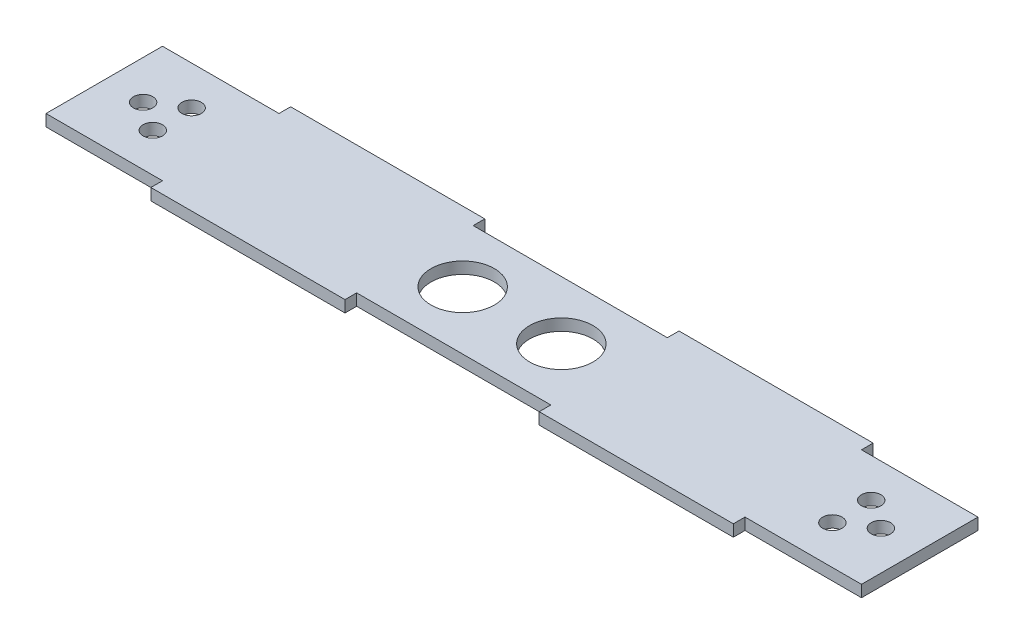
ISO-10303-21;
HEADER;
FILE_DESCRIPTION(('STEP AP214'),'2;1');
FILE_NAME('part.step','',(''),(''),'','','');
FILE_SCHEMA(('AUTOMOTIVE_DESIGN { 1 0 10303 214 1 1 1 1 }'));
ENDSEC;
DATA;
#1=APPLICATION_CONTEXT('core data for automotive mechanical design processes');
#2=APPLICATION_PROTOCOL_DEFINITION('international standard','automotive_design',2000,#1);
#3=PRODUCT_CONTEXT('',#1,'mechanical');
#4=PRODUCT('Part','Part','',(#3));
#5=PRODUCT_RELATED_PRODUCT_CATEGORY('part','',(#4));
#6=PRODUCT_DEFINITION_FORMATION('','',#4);
#7=PRODUCT_DEFINITION_CONTEXT('part definition',#1,'design');
#8=PRODUCT_DEFINITION('design','',#6,#7);
#9=PRODUCT_DEFINITION_SHAPE('','',#8);
#10=(LENGTH_UNIT() NAMED_UNIT(*) SI_UNIT(.MILLI.,.METRE.));
#11=(NAMED_UNIT(*) PLANE_ANGLE_UNIT() SI_UNIT($,.RADIAN.));
#12=(NAMED_UNIT(*) SI_UNIT($,.STERADIAN.) SOLID_ANGLE_UNIT());
#13=UNCERTAINTY_MEASURE_WITH_UNIT(LENGTH_MEASURE(1.E-05),#10,'distance_accuracy_value','');
#14=(GEOMETRIC_REPRESENTATION_CONTEXT(3) GLOBAL_UNCERTAINTY_ASSIGNED_CONTEXT((#13)) GLOBAL_UNIT_ASSIGNED_CONTEXT((#10,
#11,#12)) REPRESENTATION_CONTEXT('',''));
#15=CARTESIAN_POINT('',(0.,0.,0.));
#16=DIRECTION('',(0.,0.,1.));
#17=DIRECTION('',(1.,0.,0.));
#18=AXIS2_PLACEMENT_3D('',#15,#16,#17);
#19=CARTESIAN_POINT('',(-105.,3.,15.));
#20=DIRECTION('',(0.,0.,-1.));
#21=DIRECTION('',(-1.,0.,0.));
#22=AXIS2_PLACEMENT_3D('',#19,#20,#21);
#23=PLANE('',#22);
#24=DIRECTION('',(0.,-1.,0.));
#25=VECTOR('',#24,1.);
#26=CARTESIAN_POINT('',(25.,3.,15.));
#27=LINE('',#26,#25);
#28=CARTESIAN_POINT('',(25.,3.,15.));
#29=VERTEX_POINT('',#28);
#30=CARTESIAN_POINT('',(25.,0.,15.));
#31=VERTEX_POINT('',#30);
#32=EDGE_CURVE('E64',#29,#31,#27,.T.);
#33=ORIENTED_EDGE('',*,*,#32,.F.);
#34=DIRECTION('',(1.,0.,0.));
#35=VECTOR('',#34,1.);
#36=CARTESIAN_POINT('',(-105.,3.,15.));
#37=LINE('',#36,#35);
#38=CARTESIAN_POINT('',(-25.,3.,15.));
#39=VERTEX_POINT('',#38);
#40=EDGE_CURVE('E196',#39,#29,#37,.T.);
#41=ORIENTED_EDGE('',*,*,#40,.F.);
#42=DIRECTION('',(0.,-1.,0.));
#43=VECTOR('',#42,1.);
#44=CARTESIAN_POINT('',(-25.,3.,15.));
#45=LINE('',#44,#43);
#46=CARTESIAN_POINT('',(-25.,0.,15.));
#47=VERTEX_POINT('',#46);
#48=EDGE_CURVE('E227',#39,#47,#45,.T.);
#49=ORIENTED_EDGE('',*,*,#48,.T.);
#50=DIRECTION('',(1.,0.,0.));
#51=VECTOR('',#50,1.);
#52=CARTESIAN_POINT('',(-105.,0.,15.));
#53=LINE('',#52,#51);
#54=EDGE_CURVE('E311',#47,#31,#53,.T.);
#55=ORIENTED_EDGE('',*,*,#54,.T.);
#56=EDGE_LOOP('',(#33,#41,#49,#55));
#57=FACE_BOUND('',#56,.T.);
#58=ADVANCED_FACE('F39',(#57),#23,.F.);
#59=DIRECTION('',(0.,-1.,0.));
#60=VECTOR('',#59,1.);
#61=CARTESIAN_POINT('',(75.,3.,15.));
#62=LINE('',#61,#60);
#63=CARTESIAN_POINT('',(75.,3.,15.));
#64=VERTEX_POINT('',#63);
#65=CARTESIAN_POINT('',(75.,0.,15.));
#66=VERTEX_POINT('',#65);
#67=EDGE_CURVE('E208',#64,#66,#62,.T.);
#68=ORIENTED_EDGE('',*,*,#67,.T.);
#69=CARTESIAN_POINT('',(105.,0.,15.));
#70=VERTEX_POINT('',#69);
#71=EDGE_CURVE('E308',#66,#70,#53,.T.);
#72=ORIENTED_EDGE('',*,*,#71,.T.);
#73=DIRECTION('',(0.,-1.,0.));
#74=VECTOR('',#73,1.);
#75=CARTESIAN_POINT('',(105.,3.,15.));
#76=LINE('',#75,#74);
#77=CARTESIAN_POINT('',(105.,3.,15.));
#78=VERTEX_POINT('',#77);
#79=EDGE_CURVE('E299',#78,#70,#76,.T.);
#80=ORIENTED_EDGE('',*,*,#79,.F.);
#81=EDGE_CURVE('E56',#64,#78,#37,.T.);
#82=ORIENTED_EDGE('',*,*,#81,.F.);
#83=EDGE_LOOP('',(#68,#72,#80,#82));
#84=FACE_BOUND('',#83,.T.);
#85=ADVANCED_FACE('F361',(#84),#23,.F.);
#86=DIRECTION('',(0.,-1.,0.));
#87=VECTOR('',#86,1.);
#88=CARTESIAN_POINT('',(-75.,3.,15.));
#89=LINE('',#88,#87);
#90=CARTESIAN_POINT('',(-75.,3.,15.));
#91=VERTEX_POINT('',#90);
#92=CARTESIAN_POINT('',(-75.,0.,15.));
#93=VERTEX_POINT('',#92);
#94=EDGE_CURVE('E225',#91,#93,#89,.T.);
#95=ORIENTED_EDGE('',*,*,#94,.F.);
#96=CARTESIAN_POINT('',(-105.,3.,15.));
#97=VERTEX_POINT('',#96);
#98=EDGE_CURVE('E296',#97,#91,#37,.T.);
#99=ORIENTED_EDGE('',*,*,#98,.F.);
#100=DIRECTION('',(0.,-1.,0.));
#101=VECTOR('',#100,1.);
#102=CARTESIAN_POINT('',(-105.,3.,15.));
#103=LINE('',#102,#101);
#104=CARTESIAN_POINT('',(-105.,0.,15.));
#105=VERTEX_POINT('',#104);
#106=EDGE_CURVE('E314',#97,#105,#103,.T.);
#107=ORIENTED_EDGE('',*,*,#106,.T.);
#108=EDGE_CURVE('E289',#105,#93,#53,.T.);
#109=ORIENTED_EDGE('',*,*,#108,.T.);
#110=EDGE_LOOP('',(#95,#99,#107,#109));
#111=FACE_BOUND('',#110,.T.);
#112=ADVANCED_FACE('F385',(#111),#23,.F.);
#113=CARTESIAN_POINT('',(-105.,3.,-15.));
#114=DIRECTION('',(0.,0.,1.));
#115=DIRECTION('',(1.,0.,0.));
#116=AXIS2_PLACEMENT_3D('',#113,#114,#115);
#117=PLANE('',#116);
#118=DIRECTION('',(0.,-1.,0.));
#119=VECTOR('',#118,1.);
#120=CARTESIAN_POINT('',(25.,3.,-15.));
#121=LINE('',#120,#119);
#122=CARTESIAN_POINT('',(25.,3.,-15.));
#123=VERTEX_POINT('',#122);
#124=CARTESIAN_POINT('',(25.,0.,-15.));
#125=VERTEX_POINT('',#124);
#126=EDGE_CURVE('E255',#123,#125,#121,.T.);
#127=ORIENTED_EDGE('',*,*,#126,.T.);
#128=DIRECTION('',(-1.,0.,0.));
#129=VECTOR('',#128,1.);
#130=CARTESIAN_POINT('',(-105.,0.,-15.));
#131=LINE('',#130,#129);
#132=CARTESIAN_POINT('',(-25.,0.,-15.));
#133=VERTEX_POINT('',#132);
#134=EDGE_CURVE('E306',#125,#133,#131,.T.);
#135=ORIENTED_EDGE('',*,*,#134,.T.);
#136=DIRECTION('',(0.,-1.,0.));
#137=VECTOR('',#136,1.);
#138=CARTESIAN_POINT('',(-25.,3.,-15.));
#139=LINE('',#138,#137);
#140=CARTESIAN_POINT('',(-25.,3.,-15.));
#141=VERTEX_POINT('',#140);
#142=EDGE_CURVE('E282',#141,#133,#139,.T.);
#143=ORIENTED_EDGE('',*,*,#142,.F.);
#144=DIRECTION('',(-1.,0.,0.));
#145=VECTOR('',#144,1.);
#146=CARTESIAN_POINT('',(-105.,3.,-15.));
#147=LINE('',#146,#145);
#148=EDGE_CURVE('E294',#123,#141,#147,.T.);
#149=ORIENTED_EDGE('',*,*,#148,.F.);
#150=EDGE_LOOP('',(#127,#135,#143,#149));
#151=FACE_BOUND('',#150,.T.);
#152=ADVANCED_FACE('F399',(#151),#117,.F.);
#153=DIRECTION('',(0.,-1.,0.));
#154=VECTOR('',#153,1.);
#155=CARTESIAN_POINT('',(75.,3.,-15.));
#156=LINE('',#155,#154);
#157=CARTESIAN_POINT('',(75.,3.,-15.));
#158=VERTEX_POINT('',#157);
#159=CARTESIAN_POINT('',(75.,0.,-15.));
#160=VERTEX_POINT('',#159);
#161=EDGE_CURVE('E252',#158,#160,#156,.T.);
#162=ORIENTED_EDGE('',*,*,#161,.F.);
#163=CARTESIAN_POINT('',(105.,3.,-15.));
#164=VERTEX_POINT('',#163);
#165=EDGE_CURVE('E290',#164,#158,#147,.T.);
#166=ORIENTED_EDGE('',*,*,#165,.F.);
#167=DIRECTION('',(0.,-1.,0.));
#168=VECTOR('',#167,1.);
#169=CARTESIAN_POINT('',(105.,3.,-15.));
#170=LINE('',#169,#168);
#171=CARTESIAN_POINT('',(105.,0.,-15.));
#172=VERTEX_POINT('',#171);
#173=EDGE_CURVE('E11',#164,#172,#170,.T.);
#174=ORIENTED_EDGE('',*,*,#173,.T.);
#175=EDGE_CURVE('E303',#172,#160,#131,.T.);
#176=ORIENTED_EDGE('',*,*,#175,.T.);
#177=EDGE_LOOP('',(#162,#166,#174,#176));
#178=FACE_BOUND('',#177,.T.);
#179=ADVANCED_FACE('F412',(#178),#117,.F.);
#180=CARTESIAN_POINT('',(105.,3.,15.));
#181=DIRECTION('',(-1.,0.,0.));
#182=DIRECTION('',(0.,0.,1.));
#183=AXIS2_PLACEMENT_3D('',#180,#181,#182);
#184=PLANE('',#183);
#185=DIRECTION('',(0.,0.,-1.));
#186=VECTOR('',#185,1.);
#187=CARTESIAN_POINT('',(105.,0.,15.));
#188=LINE('',#187,#186);
#189=EDGE_CURVE('E285',#70,#172,#188,.T.);
#190=ORIENTED_EDGE('',*,*,#189,.T.);
#191=ORIENTED_EDGE('',*,*,#173,.F.);
#192=DIRECTION('',(0.,0.,-1.));
#193=VECTOR('',#192,1.);
#194=CARTESIAN_POINT('',(105.,3.,15.));
#195=LINE('',#194,#193);
#196=EDGE_CURVE('E286',#78,#164,#195,.T.);
#197=ORIENTED_EDGE('',*,*,#196,.F.);
#198=ORIENTED_EDGE('',*,*,#79,.T.);
#199=EDGE_LOOP('',(#190,#191,#197,#198));
#200=FACE_BOUND('',#199,.T.);
#201=ADVANCED_FACE('F41',(#200),#184,.F.);
#202=CARTESIAN_POINT('',(-75.,3.,-15.));
#203=VERTEX_POINT('',#202);
#204=CARTESIAN_POINT('',(-105.,3.,-15.));
#205=VERTEX_POINT('',#204);
#206=EDGE_CURVE('E288',#203,#205,#147,.T.);
#207=ORIENTED_EDGE('',*,*,#206,.F.);
#208=DIRECTION('',(0.,-1.,0.));
#209=VECTOR('',#208,1.);
#210=CARTESIAN_POINT('',(-75.,3.,-15.));
#211=LINE('',#210,#209);
#212=CARTESIAN_POINT('',(-75.,0.,-15.));
#213=VERTEX_POINT('',#212);
#214=EDGE_CURVE('E269',#203,#213,#211,.T.);
#215=ORIENTED_EDGE('',*,*,#214,.T.);
#216=CARTESIAN_POINT('',(-105.,0.,-15.));
#217=VERTEX_POINT('',#216);
#218=EDGE_CURVE('E302',#213,#217,#131,.T.);
#219=ORIENTED_EDGE('',*,*,#218,.T.);
#220=DIRECTION('',(0.,-1.,0.));
#221=VECTOR('',#220,1.);
#222=CARTESIAN_POINT('',(-105.,3.,-15.));
#223=LINE('',#222,#221);
#224=EDGE_CURVE('E48',#205,#217,#223,.T.);
#225=ORIENTED_EDGE('',*,*,#224,.F.);
#226=EDGE_LOOP('',(#207,#215,#219,#225));
#227=FACE_BOUND('',#226,.T.);
#228=ADVANCED_FACE('F410',(#227),#117,.F.);
#229=CARTESIAN_POINT('',(-105.,3.,15.));
#230=DIRECTION('',(1.,0.,0.));
#231=DIRECTION('',(0.,0.,-1.));
#232=AXIS2_PLACEMENT_3D('',#229,#230,#231);
#233=PLANE('',#232);
#234=DIRECTION('',(0.,0.,1.));
#235=VECTOR('',#234,1.);
#236=CARTESIAN_POINT('',(-105.,0.,15.));
#237=LINE('',#236,#235);
#238=EDGE_CURVE('E305',#217,#105,#237,.T.);
#239=ORIENTED_EDGE('',*,*,#238,.T.);
#240=ORIENTED_EDGE('',*,*,#106,.F.);
#241=DIRECTION('',(0.,0.,1.));
#242=VECTOR('',#241,1.);
#243=CARTESIAN_POINT('',(-105.,3.,15.));
#244=LINE('',#243,#242);
#245=EDGE_CURVE('E293',#205,#97,#244,.T.);
#246=ORIENTED_EDGE('',*,*,#245,.F.);
#247=ORIENTED_EDGE('',*,*,#224,.T.);
#248=EDGE_LOOP('',(#239,#240,#246,#247));
#249=FACE_BOUND('',#248,.T.);
#250=ADVANCED_FACE('F390',(#249),#233,.F.);
#251=CARTESIAN_POINT('',(0.,3.,0.));
#252=DIRECTION('',(0.,-1.,0.));
#253=DIRECTION('',(0.,0.,-1.));
#254=AXIS2_PLACEMENT_3D('',#251,#252,#253);
#255=PLANE('',#254);
#256=CARTESIAN_POINT('',(-95.,3.,0.));
#257=DIRECTION('',(0.,1.,0.));
#258=DIRECTION('',(0.,0.,1.));
#259=AXIS2_PLACEMENT_3D('',#256,#257,#258);
#260=CIRCLE('',#259,2.50000000000001);
#261=CARTESIAN_POINT('',(-95.,3.,2.50000000000001));
#262=VERTEX_POINT('',#261);
#263=EDGE_CURVE('E330',#262,#262,#260,.T.);
#264=ORIENTED_EDGE('',*,*,#263,.F.);
#265=EDGE_LOOP('',(#264));
#266=FACE_BOUND('',#265,.T.);
#267=CARTESIAN_POINT('',(-87.5000000000001,3.,-5.));
#268=DIRECTION('',(0.,1.,0.));
#269=DIRECTION('',(0.,0.,1.));
#270=AXIS2_PLACEMENT_3D('',#267,#268,#269);
#271=CIRCLE('',#270,2.5);
#272=CARTESIAN_POINT('',(-87.5000000000001,3.,-2.5));
#273=VERTEX_POINT('',#272);
#274=EDGE_CURVE('E713',#273,#273,#271,.T.);
#275=ORIENTED_EDGE('',*,*,#274,.F.);
#276=EDGE_LOOP('',(#275));
#277=FACE_BOUND('',#276,.T.);
#278=CARTESIAN_POINT('',(-87.5000000000001,3.,5.));
#279=DIRECTION('',(0.,1.,0.));
#280=DIRECTION('',(0.,0.,1.));
#281=AXIS2_PLACEMENT_3D('',#278,#279,#280);
#282=CIRCLE('',#281,2.5);
#283=CARTESIAN_POINT('',(-87.5000000000001,3.,7.5));
#284=VERTEX_POINT('',#283);
#285=EDGE_CURVE('E716',#284,#284,#282,.T.);
#286=ORIENTED_EDGE('',*,*,#285,.F.);
#287=EDGE_LOOP('',(#286));
#288=FACE_BOUND('',#287,.T.);
#289=CARTESIAN_POINT('',(87.5,3.,5.));
#290=DIRECTION('',(0.,1.,0.));
#291=DIRECTION('',(0.,0.,-1.));
#292=AXIS2_PLACEMENT_3D('',#289,#290,#291);
#293=CIRCLE('',#292,2.5);
#294=CARTESIAN_POINT('',(87.5,3.,2.5));
#295=VERTEX_POINT('',#294);
#296=EDGE_CURVE('E721',#295,#295,#293,.T.);
#297=ORIENTED_EDGE('',*,*,#296,.F.);
#298=EDGE_LOOP('',(#297));
#299=FACE_BOUND('',#298,.T.);
#300=CARTESIAN_POINT('',(87.5,3.,-5.));
#301=DIRECTION('',(0.,1.,0.));
#302=DIRECTION('',(0.,0.,-1.));
#303=AXIS2_PLACEMENT_3D('',#300,#301,#302);
#304=CIRCLE('',#303,2.5);
#305=CARTESIAN_POINT('',(87.5,3.,-7.49999999999999));
#306=VERTEX_POINT('',#305);
#307=EDGE_CURVE('E724',#306,#306,#304,.T.);
#308=ORIENTED_EDGE('',*,*,#307,.F.);
#309=EDGE_LOOP('',(#308));
#310=FACE_BOUND('',#309,.T.);
#311=CARTESIAN_POINT('',(95.,3.,0.));
#312=DIRECTION('',(0.,1.,0.));
#313=DIRECTION('',(0.,0.,-1.));
#314=AXIS2_PLACEMENT_3D('',#311,#312,#313);
#315=CIRCLE('',#314,2.50000000000001);
#316=CARTESIAN_POINT('',(95.,3.,-2.50000000000001));
#317=VERTEX_POINT('',#316);
#318=EDGE_CURVE('E726',#317,#317,#315,.T.);
#319=ORIENTED_EDGE('',*,*,#318,.F.);
#320=EDGE_LOOP('',(#319));
#321=FACE_BOUND('',#320,.T.);
#322=CARTESIAN_POINT('',(-12.7,3.,0.));
#323=DIRECTION('',(0.,1.,0.));
#324=DIRECTION('',(0.,0.,1.));
#325=AXIS2_PLACEMENT_3D('',#322,#323,#324);
#326=CIRCLE('',#325,8.15);
#327=CARTESIAN_POINT('',(-12.7,3.,8.15));
#328=VERTEX_POINT('',#327);
#329=EDGE_CURVE('E323',#328,#328,#326,.T.);
#330=ORIENTED_EDGE('',*,*,#329,.F.);
#331=EDGE_LOOP('',(#330));
#332=FACE_BOUND('',#331,.T.);
#333=CARTESIAN_POINT('',(12.7,3.,0.));
#334=DIRECTION('',(0.,1.,0.));
#335=DIRECTION('',(0.,0.,-1.));
#336=AXIS2_PLACEMENT_3D('',#333,#334,#335);
#337=CIRCLE('',#336,8.15);
#338=CARTESIAN_POINT('',(12.7,3.,-8.15000000000006));
#339=VERTEX_POINT('',#338);
#340=EDGE_CURVE('E343',#339,#339,#337,.T.);
#341=ORIENTED_EDGE('',*,*,#340,.F.);
#342=EDGE_LOOP('',(#341));
#343=FACE_BOUND('',#342,.T.);
#344=ORIENTED_EDGE('',*,*,#196,.T.);
#345=ORIENTED_EDGE('',*,*,#165,.T.);
#346=DIRECTION('',(0.,0.,-1.));
#347=VECTOR('',#346,1.);
#348=CARTESIAN_POINT('',(75.,3.,-18.));
#349=LINE('',#348,#347);
#350=CARTESIAN_POINT('',(75.,3.,-18.));
#351=VERTEX_POINT('',#350);
#352=EDGE_CURVE('E241',#158,#351,#349,.T.);
#353=ORIENTED_EDGE('',*,*,#352,.T.);
#354=DIRECTION('',(-1.,0.,0.));
#355=VECTOR('',#354,1.);
#356=CARTESIAN_POINT('',(25.,3.,-18.));
#357=LINE('',#356,#355);
#358=CARTESIAN_POINT('',(25.,3.,-18.));
#359=VERTEX_POINT('',#358);
#360=EDGE_CURVE('E234',#351,#359,#357,.T.);
#361=ORIENTED_EDGE('',*,*,#360,.T.);
#362=DIRECTION('',(0.,0.,1.));
#363=VECTOR('',#362,1.);
#364=CARTESIAN_POINT('',(25.,3.,-18.));
#365=LINE('',#364,#363);
#366=EDGE_CURVE('E237',#359,#123,#365,.T.);
#367=ORIENTED_EDGE('',*,*,#366,.T.);
#368=ORIENTED_EDGE('',*,*,#148,.T.);
#369=DIRECTION('',(0.,0.,-1.));
#370=VECTOR('',#369,1.);
#371=CARTESIAN_POINT('',(-25.,3.,-15.));
#372=LINE('',#371,#370);
#373=CARTESIAN_POINT('',(-25.,3.,-18.));
#374=VERTEX_POINT('',#373);
#375=EDGE_CURVE('E262',#141,#374,#372,.T.);
#376=ORIENTED_EDGE('',*,*,#375,.T.);
#377=DIRECTION('',(-1.,0.,0.));
#378=VECTOR('',#377,1.);
#379=CARTESIAN_POINT('',(-75.,3.,-18.));
#380=LINE('',#379,#378);
#381=CARTESIAN_POINT('',(-75.,3.,-18.));
#382=VERTEX_POINT('',#381);
#383=EDGE_CURVE('E264',#374,#382,#380,.T.);
#384=ORIENTED_EDGE('',*,*,#383,.T.);
#385=DIRECTION('',(0.,0.,1.));
#386=VECTOR('',#385,1.);
#387=CARTESIAN_POINT('',(-75.,3.,-15.));
#388=LINE('',#387,#386);
#389=EDGE_CURVE('E267',#382,#203,#388,.T.);
#390=ORIENTED_EDGE('',*,*,#389,.T.);
#391=ORIENTED_EDGE('',*,*,#206,.T.);
#392=ORIENTED_EDGE('',*,*,#245,.T.);
#393=ORIENTED_EDGE('',*,*,#98,.T.);
#394=DIRECTION('',(0.,0.,1.));
#395=VECTOR('',#394,1.);
#396=CARTESIAN_POINT('',(-75.,3.,15.));
#397=LINE('',#396,#395);
#398=CARTESIAN_POINT('',(-75.,3.,18.));
#399=VERTEX_POINT('',#398);
#400=EDGE_CURVE('E218',#91,#399,#397,.T.);
#401=ORIENTED_EDGE('',*,*,#400,.T.);
#402=DIRECTION('',(1.,0.,0.));
#403=VECTOR('',#402,1.);
#404=CARTESIAN_POINT('',(-75.,3.,18.));
#405=LINE('',#404,#403);
#406=CARTESIAN_POINT('',(-25.,3.,18.));
#407=VERTEX_POINT('',#406);
#408=EDGE_CURVE('E212',#399,#407,#405,.T.);
#409=ORIENTED_EDGE('',*,*,#408,.T.);
#410=DIRECTION('',(0.,0.,-1.));
#411=VECTOR('',#410,1.);
#412=CARTESIAN_POINT('',(-25.,3.,15.));
#413=LINE('',#412,#411);
#414=EDGE_CURVE('E215',#407,#39,#413,.T.);
#415=ORIENTED_EDGE('',*,*,#414,.T.);
#416=ORIENTED_EDGE('',*,*,#40,.T.);
#417=DIRECTION('',(0.,0.,1.));
#418=VECTOR('',#417,1.);
#419=CARTESIAN_POINT('',(25.,3.,18.));
#420=LINE('',#419,#418);
#421=CARTESIAN_POINT('',(25.,3.,18.));
#422=VERTEX_POINT('',#421);
#423=EDGE_CURVE('E191',#29,#422,#420,.T.);
#424=ORIENTED_EDGE('',*,*,#423,.T.);
#425=DIRECTION('',(1.,0.,0.));
#426=VECTOR('',#425,1.);
#427=CARTESIAN_POINT('',(25.,3.,18.));
#428=LINE('',#427,#426);
#429=CARTESIAN_POINT('',(75.,3.,18.));
#430=VERTEX_POINT('',#429);
#431=EDGE_CURVE('E180',#422,#430,#428,.T.);
#432=ORIENTED_EDGE('',*,*,#431,.T.);
#433=DIRECTION('',(0.,0.,-1.));
#434=VECTOR('',#433,1.);
#435=CARTESIAN_POINT('',(75.,3.,18.));
#436=LINE('',#435,#434);
#437=EDGE_CURVE('E190',#430,#64,#436,.T.);
#438=ORIENTED_EDGE('',*,*,#437,.T.);
#439=ORIENTED_EDGE('',*,*,#81,.T.);
#440=EDGE_LOOP('',(#344,#345,#353,#361,#367,#368,#376,#384,#390,#391,#392,#393,#401,#409,#415,
#416,#424,#432,#438,#439));
#441=FACE_BOUND('',#440,.T.);
#442=ADVANCED_FACE('F195',(#266,#277,#288,#299,#310,#321,#332,#343,#441),#255,.F.);
#443=CARTESIAN_POINT('',(0.,0.,0.));
#444=DIRECTION('',(0.,-1.,0.));
#445=DIRECTION('',(0.,0.,-1.));
#446=AXIS2_PLACEMENT_3D('',#443,#444,#445);
#447=PLANE('',#446);
#448=CARTESIAN_POINT('',(-95.,0.,0.));
#449=DIRECTION('',(0.,-1.,0.));
#450=DIRECTION('',(0.,0.,-1.));
#451=AXIS2_PLACEMENT_3D('',#448,#449,#450);
#452=CIRCLE('',#451,2.50000000000001);
#453=CARTESIAN_POINT('',(-95.,0.,-2.50000000000001));
#454=VERTEX_POINT('',#453);
#455=EDGE_CURVE('E43',#454,#454,#452,.T.);
#456=ORIENTED_EDGE('',*,*,#455,.F.);
#457=EDGE_LOOP('',(#456));
#458=FACE_BOUND('',#457,.T.);
#459=CARTESIAN_POINT('',(-87.5000000000001,0.,-5.));
#460=DIRECTION('',(0.,-1.,0.));
#461=DIRECTION('',(0.,0.,-1.));
#462=AXIS2_PLACEMENT_3D('',#459,#460,#461);
#463=CIRCLE('',#462,2.5);
#464=CARTESIAN_POINT('',(-87.5000000000001,0.,-7.49999999999999));
#465=VERTEX_POINT('',#464);
#466=EDGE_CURVE('E338',#465,#465,#463,.T.);
#467=ORIENTED_EDGE('',*,*,#466,.F.);
#468=EDGE_LOOP('',(#467));
#469=FACE_BOUND('',#468,.T.);
#470=CARTESIAN_POINT('',(-87.5000000000001,0.,5.));
#471=DIRECTION('',(0.,-1.,0.));
#472=DIRECTION('',(0.,0.,-1.));
#473=AXIS2_PLACEMENT_3D('',#470,#471,#472);
#474=CIRCLE('',#473,2.5);
#475=CARTESIAN_POINT('',(-87.5000000000001,0.,2.5));
#476=VERTEX_POINT('',#475);
#477=EDGE_CURVE('E336',#476,#476,#474,.T.);
#478=ORIENTED_EDGE('',*,*,#477,.F.);
#479=EDGE_LOOP('',(#478));
#480=FACE_BOUND('',#479,.T.);
#481=CARTESIAN_POINT('',(87.5,0.,5.));
#482=DIRECTION('',(0.,-1.,0.));
#483=DIRECTION('',(0.,0.,-1.));
#484=AXIS2_PLACEMENT_3D('',#481,#482,#483);
#485=CIRCLE('',#484,2.5);
#486=CARTESIAN_POINT('',(87.5,0.,2.5));
#487=VERTEX_POINT('',#486);
#488=EDGE_CURVE('E333',#487,#487,#485,.T.);
#489=ORIENTED_EDGE('',*,*,#488,.F.);
#490=EDGE_LOOP('',(#489));
#491=FACE_BOUND('',#490,.T.);
#492=CARTESIAN_POINT('',(87.5,0.,-5.));
#493=DIRECTION('',(0.,-1.,0.));
#494=DIRECTION('',(0.,0.,-1.));
#495=AXIS2_PLACEMENT_3D('',#492,#493,#494);
#496=CIRCLE('',#495,2.5);
#497=CARTESIAN_POINT('',(87.5,0.,-7.49999999999999));
#498=VERTEX_POINT('',#497);
#499=EDGE_CURVE('E329',#498,#498,#496,.T.);
#500=ORIENTED_EDGE('',*,*,#499,.F.);
#501=EDGE_LOOP('',(#500));
#502=FACE_BOUND('',#501,.T.);
#503=CARTESIAN_POINT('',(95.,0.,0.));
#504=DIRECTION('',(0.,-1.,0.));
#505=DIRECTION('',(0.,0.,-1.));
#506=AXIS2_PLACEMENT_3D('',#503,#504,#505);
#507=CIRCLE('',#506,2.50000000000001);
#508=CARTESIAN_POINT('',(95.,0.,-2.50000000000001));
#509=VERTEX_POINT('',#508);
#510=EDGE_CURVE('E326',#509,#509,#507,.T.);
#511=ORIENTED_EDGE('',*,*,#510,.F.);
#512=EDGE_LOOP('',(#511));
#513=FACE_BOUND('',#512,.T.);
#514=CARTESIAN_POINT('',(-12.7,0.,0.));
#515=DIRECTION('',(0.,-1.,0.));
#516=DIRECTION('',(0.,0.,-1.));
#517=AXIS2_PLACEMENT_3D('',#514,#515,#516);
#518=CIRCLE('',#517,8.15);
#519=CARTESIAN_POINT('',(-12.7,0.,-8.15));
#520=VERTEX_POINT('',#519);
#521=EDGE_CURVE('E322',#520,#520,#518,.T.);
#522=ORIENTED_EDGE('',*,*,#521,.F.);
#523=EDGE_LOOP('',(#522));
#524=FACE_BOUND('',#523,.T.);
#525=CARTESIAN_POINT('',(12.7,0.,0.));
#526=DIRECTION('',(0.,-1.,0.));
#527=DIRECTION('',(0.,0.,-1.));
#528=AXIS2_PLACEMENT_3D('',#525,#526,#527);
#529=CIRCLE('',#528,8.15);
#530=CARTESIAN_POINT('',(12.7,0.,-8.15000000000006));
#531=VERTEX_POINT('',#530);
#532=EDGE_CURVE('E319',#531,#531,#529,.T.);
#533=ORIENTED_EDGE('',*,*,#532,.F.);
#534=EDGE_LOOP('',(#533));
#535=FACE_BOUND('',#534,.T.);
#536=ORIENTED_EDGE('',*,*,#189,.F.);
#537=ORIENTED_EDGE('',*,*,#71,.F.);
#538=DIRECTION('',(0.,0.,-1.));
#539=VECTOR('',#538,1.);
#540=CARTESIAN_POINT('',(75.,0.,18.));
#541=LINE('',#540,#539);
#542=CARTESIAN_POINT('',(75.,0.,18.));
#543=VERTEX_POINT('',#542);
#544=EDGE_CURVE('E198',#543,#66,#541,.T.);
#545=ORIENTED_EDGE('',*,*,#544,.F.);
#546=DIRECTION('',(1.,0.,0.));
#547=VECTOR('',#546,1.);
#548=CARTESIAN_POINT('',(25.,0.,18.));
#549=LINE('',#548,#547);
#550=CARTESIAN_POINT('',(25.,0.,18.));
#551=VERTEX_POINT('',#550);
#552=EDGE_CURVE('E356',#551,#543,#549,.T.);
#553=ORIENTED_EDGE('',*,*,#552,.F.);
#554=DIRECTION('',(0.,0.,1.));
#555=VECTOR('',#554,1.);
#556=CARTESIAN_POINT('',(25.,0.,18.));
#557=LINE('',#556,#555);
#558=EDGE_CURVE('E202',#31,#551,#557,.T.);
#559=ORIENTED_EDGE('',*,*,#558,.F.);
#560=ORIENTED_EDGE('',*,*,#54,.F.);
#561=DIRECTION('',(0.,0.,-1.));
#562=VECTOR('',#561,1.);
#563=CARTESIAN_POINT('',(-25.,0.,15.));
#564=LINE('',#563,#562);
#565=CARTESIAN_POINT('',(-25.,0.,18.));
#566=VERTEX_POINT('',#565);
#567=EDGE_CURVE('E206',#566,#47,#564,.T.);
#568=ORIENTED_EDGE('',*,*,#567,.F.);
#569=DIRECTION('',(1.,0.,0.));
#570=VECTOR('',#569,1.);
#571=CARTESIAN_POINT('',(-75.,0.,18.));
#572=LINE('',#571,#570);
#573=CARTESIAN_POINT('',(-75.,0.,18.));
#574=VERTEX_POINT('',#573);
#575=EDGE_CURVE('E203',#574,#566,#572,.T.);
#576=ORIENTED_EDGE('',*,*,#575,.F.);
#577=DIRECTION('',(0.,0.,1.));
#578=VECTOR('',#577,1.);
#579=CARTESIAN_POINT('',(-75.,0.,15.));
#580=LINE('',#579,#578);
#581=EDGE_CURVE('E216',#93,#574,#580,.T.);
#582=ORIENTED_EDGE('',*,*,#581,.F.);
#583=ORIENTED_EDGE('',*,*,#108,.F.);
#584=ORIENTED_EDGE('',*,*,#238,.F.);
#585=ORIENTED_EDGE('',*,*,#218,.F.);
#586=DIRECTION('',(0.,0.,1.));
#587=VECTOR('',#586,1.);
#588=CARTESIAN_POINT('',(-75.,0.,-15.));
#589=LINE('',#588,#587);
#590=CARTESIAN_POINT('',(-75.,0.,-18.));
#591=VERTEX_POINT('',#590);
#592=EDGE_CURVE('E265',#591,#213,#589,.T.);
#593=ORIENTED_EDGE('',*,*,#592,.F.);
#594=DIRECTION('',(-1.,0.,0.));
#595=VECTOR('',#594,1.);
#596=CARTESIAN_POINT('',(-75.,0.,-18.));
#597=LINE('',#596,#595);
#598=CARTESIAN_POINT('',(-25.,0.,-18.));
#599=VERTEX_POINT('',#598);
#600=EDGE_CURVE('E271',#599,#591,#597,.T.);
#601=ORIENTED_EDGE('',*,*,#600,.F.);
#602=DIRECTION('',(0.,0.,-1.));
#603=VECTOR('',#602,1.);
#604=CARTESIAN_POINT('',(-25.,0.,-15.));
#605=LINE('',#604,#603);
#606=EDGE_CURVE('E261',#133,#599,#605,.T.);
#607=ORIENTED_EDGE('',*,*,#606,.F.);
#608=ORIENTED_EDGE('',*,*,#134,.F.);
#609=DIRECTION('',(0.,0.,1.));
#610=VECTOR('',#609,1.);
#611=CARTESIAN_POINT('',(25.,0.,-18.));
#612=LINE('',#611,#610);
#613=CARTESIAN_POINT('',(25.,0.,-18.));
#614=VERTEX_POINT('',#613);
#615=EDGE_CURVE('E246',#614,#125,#612,.T.);
#616=ORIENTED_EDGE('',*,*,#615,.F.);
#617=DIRECTION('',(-1.,0.,0.));
#618=VECTOR('',#617,1.);
#619=CARTESIAN_POINT('',(25.,0.,-18.));
#620=LINE('',#619,#618);
#621=CARTESIAN_POINT('',(75.,0.,-18.));
#622=VERTEX_POINT('',#621);
#623=EDGE_CURVE('E233',#622,#614,#620,.T.);
#624=ORIENTED_EDGE('',*,*,#623,.F.);
#625=DIRECTION('',(0.,0.,-1.));
#626=VECTOR('',#625,1.);
#627=CARTESIAN_POINT('',(75.,0.,-18.));
#628=LINE('',#627,#626);
#629=EDGE_CURVE('E238',#160,#622,#628,.T.);
#630=ORIENTED_EDGE('',*,*,#629,.F.);
#631=ORIENTED_EDGE('',*,*,#175,.F.);
#632=EDGE_LOOP('',(#536,#537,#545,#553,#559,#560,#568,#576,#582,#583,#584,#585,#593,#601,#607,
#608,#616,#624,#630,#631));
#633=FACE_BOUND('',#632,.T.);
#634=ADVANCED_FACE('F367',(#458,#469,#480,#491,#502,#513,#524,#535,#633),#447,.T.);
#635=CARTESIAN_POINT('',(-25.,3.,-15.));
#636=DIRECTION('',(-1.,0.,0.));
#637=DIRECTION('',(0.,0.,1.));
#638=AXIS2_PLACEMENT_3D('',#635,#636,#637);
#639=PLANE('',#638);
#640=ORIENTED_EDGE('',*,*,#606,.T.);
#641=DIRECTION('',(0.,-1.,0.));
#642=VECTOR('',#641,1.);
#643=CARTESIAN_POINT('',(-25.,3.,-18.));
#644=LINE('',#643,#642);
#645=EDGE_CURVE('E279',#374,#599,#644,.T.);
#646=ORIENTED_EDGE('',*,*,#645,.F.);
#647=ORIENTED_EDGE('',*,*,#375,.F.);
#648=ORIENTED_EDGE('',*,*,#142,.T.);
#649=EDGE_LOOP('',(#640,#646,#647,#648));
#650=FACE_BOUND('',#649,.T.);
#651=ADVANCED_FACE('F404',(#650),#639,.F.);
#652=CARTESIAN_POINT('',(-75.,3.,-18.));
#653=DIRECTION('',(0.,0.,1.));
#654=DIRECTION('',(1.,0.,0.));
#655=AXIS2_PLACEMENT_3D('',#652,#653,#654);
#656=PLANE('',#655);
#657=ORIENTED_EDGE('',*,*,#600,.T.);
#658=DIRECTION('',(0.,-1.,0.));
#659=VECTOR('',#658,1.);
#660=CARTESIAN_POINT('',(-75.,3.,-18.));
#661=LINE('',#660,#659);
#662=EDGE_CURVE('E276',#382,#591,#661,.T.);
#663=ORIENTED_EDGE('',*,*,#662,.F.);
#664=ORIENTED_EDGE('',*,*,#383,.F.);
#665=ORIENTED_EDGE('',*,*,#645,.T.);
#666=EDGE_LOOP('',(#657,#663,#664,#665));
#667=FACE_BOUND('',#666,.T.);
#668=ADVANCED_FACE('F608',(#667),#656,.F.);
#669=CARTESIAN_POINT('',(-75.,3.,-15.));
#670=DIRECTION('',(1.,0.,0.));
#671=DIRECTION('',(0.,0.,-1.));
#672=AXIS2_PLACEMENT_3D('',#669,#670,#671);
#673=PLANE('',#672);
#674=ORIENTED_EDGE('',*,*,#592,.T.);
#675=ORIENTED_EDGE('',*,*,#214,.F.);
#676=ORIENTED_EDGE('',*,*,#389,.F.);
#677=ORIENTED_EDGE('',*,*,#662,.T.);
#678=EDGE_LOOP('',(#674,#675,#676,#677));
#679=FACE_BOUND('',#678,.T.);
#680=ADVANCED_FACE('F604',(#679),#673,.F.);
#681=CARTESIAN_POINT('',(25.,3.,-18.));
#682=DIRECTION('',(0.,0.,1.));
#683=DIRECTION('',(1.,0.,0.));
#684=AXIS2_PLACEMENT_3D('',#681,#682,#683);
#685=PLANE('',#684);
#686=ORIENTED_EDGE('',*,*,#623,.T.);
#687=DIRECTION('',(0.,-1.,0.));
#688=VECTOR('',#687,1.);
#689=CARTESIAN_POINT('',(25.,3.,-18.));
#690=LINE('',#689,#688);
#691=EDGE_CURVE('E258',#359,#614,#690,.T.);
#692=ORIENTED_EDGE('',*,*,#691,.F.);
#693=ORIENTED_EDGE('',*,*,#360,.F.);
#694=DIRECTION('',(0.,-1.,0.));
#695=VECTOR('',#694,1.);
#696=CARTESIAN_POINT('',(75.,3.,-18.));
#697=LINE('',#696,#695);
#698=EDGE_CURVE('E243',#351,#622,#697,.T.);
#699=ORIENTED_EDGE('',*,*,#698,.T.);
#700=EDGE_LOOP('',(#686,#692,#693,#699));
#701=FACE_BOUND('',#700,.T.);
#702=ADVANCED_FACE('F600',(#701),#685,.F.);
#703=CARTESIAN_POINT('',(25.,3.,-18.));
#704=DIRECTION('',(1.,0.,0.));
#705=DIRECTION('',(0.,0.,-1.));
#706=AXIS2_PLACEMENT_3D('',#703,#704,#705);
#707=PLANE('',#706);
#708=ORIENTED_EDGE('',*,*,#615,.T.);
#709=ORIENTED_EDGE('',*,*,#126,.F.);
#710=ORIENTED_EDGE('',*,*,#366,.F.);
#711=ORIENTED_EDGE('',*,*,#691,.T.);
#712=EDGE_LOOP('',(#708,#709,#710,#711));
#713=FACE_BOUND('',#712,.T.);
#714=ADVANCED_FACE('F596',(#713),#707,.F.);
#715=CARTESIAN_POINT('',(75.,3.,-18.));
#716=DIRECTION('',(-1.,0.,0.));
#717=DIRECTION('',(0.,0.,1.));
#718=AXIS2_PLACEMENT_3D('',#715,#716,#717);
#719=PLANE('',#718);
#720=ORIENTED_EDGE('',*,*,#629,.T.);
#721=ORIENTED_EDGE('',*,*,#698,.F.);
#722=ORIENTED_EDGE('',*,*,#352,.F.);
#723=ORIENTED_EDGE('',*,*,#161,.T.);
#724=EDGE_LOOP('',(#720,#721,#722,#723));
#725=FACE_BOUND('',#724,.T.);
#726=ADVANCED_FACE('F593',(#725),#719,.F.);
#727=CARTESIAN_POINT('',(-75.,3.,18.));
#728=DIRECTION('',(0.,0.,-1.));
#729=DIRECTION('',(-1.,0.,0.));
#730=AXIS2_PLACEMENT_3D('',#727,#728,#729);
#731=PLANE('',#730);
#732=ORIENTED_EDGE('',*,*,#575,.T.);
#733=DIRECTION('',(0.,-1.,0.));
#734=VECTOR('',#733,1.);
#735=CARTESIAN_POINT('',(-25.,3.,18.));
#736=LINE('',#735,#734);
#737=EDGE_CURVE('E230',#407,#566,#736,.T.);
#738=ORIENTED_EDGE('',*,*,#737,.F.);
#739=ORIENTED_EDGE('',*,*,#408,.F.);
#740=DIRECTION('',(0.,-1.,0.));
#741=VECTOR('',#740,1.);
#742=CARTESIAN_POINT('',(-75.,3.,18.));
#743=LINE('',#742,#741);
#744=EDGE_CURVE('E219',#399,#574,#743,.T.);
#745=ORIENTED_EDGE('',*,*,#744,.T.);
#746=EDGE_LOOP('',(#732,#738,#739,#745));
#747=FACE_BOUND('',#746,.T.);
#748=ADVANCED_FACE('F377',(#747),#731,.F.);
#749=CARTESIAN_POINT('',(-25.,3.,15.));
#750=DIRECTION('',(-1.,0.,0.));
#751=DIRECTION('',(0.,0.,1.));
#752=AXIS2_PLACEMENT_3D('',#749,#750,#751);
#753=PLANE('',#752);
#754=ORIENTED_EDGE('',*,*,#567,.T.);
#755=ORIENTED_EDGE('',*,*,#48,.F.);
#756=ORIENTED_EDGE('',*,*,#414,.F.);
#757=ORIENTED_EDGE('',*,*,#737,.T.);
#758=EDGE_LOOP('',(#754,#755,#756,#757));
#759=FACE_BOUND('',#758,.T.);
#760=ADVANCED_FACE('F374',(#759),#753,.F.);
#761=CARTESIAN_POINT('',(-75.,3.,15.));
#762=DIRECTION('',(1.,0.,0.));
#763=DIRECTION('',(0.,0.,-1.));
#764=AXIS2_PLACEMENT_3D('',#761,#762,#763);
#765=PLANE('',#764);
#766=ORIENTED_EDGE('',*,*,#581,.T.);
#767=ORIENTED_EDGE('',*,*,#744,.F.);
#768=ORIENTED_EDGE('',*,*,#400,.F.);
#769=ORIENTED_EDGE('',*,*,#94,.T.);
#770=EDGE_LOOP('',(#766,#767,#768,#769));
#771=FACE_BOUND('',#770,.T.);
#772=ADVANCED_FACE('F380',(#771),#765,.F.);
#773=CARTESIAN_POINT('',(25.,3.,18.));
#774=DIRECTION('',(1.,0.,0.));
#775=DIRECTION('',(0.,0.,-1.));
#776=AXIS2_PLACEMENT_3D('',#773,#774,#775);
#777=PLANE('',#776);
#778=ORIENTED_EDGE('',*,*,#558,.T.);
#779=DIRECTION('',(0.,-1.,0.));
#780=VECTOR('',#779,1.);
#781=CARTESIAN_POINT('',(25.,3.,18.));
#782=LINE('',#781,#780);
#783=EDGE_CURVE('E184',#422,#551,#782,.T.);
#784=ORIENTED_EDGE('',*,*,#783,.F.);
#785=ORIENTED_EDGE('',*,*,#423,.F.);
#786=ORIENTED_EDGE('',*,*,#32,.T.);
#787=EDGE_LOOP('',(#778,#784,#785,#786));
#788=FACE_BOUND('',#787,.T.);
#789=ADVANCED_FACE('F200',(#788),#777,.F.);
#790=CARTESIAN_POINT('',(25.,3.,18.));
#791=DIRECTION('',(0.,0.,-1.));
#792=DIRECTION('',(-1.,0.,0.));
#793=AXIS2_PLACEMENT_3D('',#790,#791,#792);
#794=PLANE('',#793);
#795=ORIENTED_EDGE('',*,*,#552,.T.);
#796=DIRECTION('',(0.,-1.,0.));
#797=VECTOR('',#796,1.);
#798=CARTESIAN_POINT('',(75.,3.,18.));
#799=LINE('',#798,#797);
#800=EDGE_CURVE('E187',#430,#543,#799,.T.);
#801=ORIENTED_EDGE('',*,*,#800,.F.);
#802=ORIENTED_EDGE('',*,*,#431,.F.);
#803=ORIENTED_EDGE('',*,*,#783,.T.);
#804=EDGE_LOOP('',(#795,#801,#802,#803));
#805=FACE_BOUND('',#804,.T.);
#806=ADVANCED_FACE('F182',(#805),#794,.F.);
#807=CARTESIAN_POINT('',(75.,3.,18.));
#808=DIRECTION('',(-1.,0.,0.));
#809=DIRECTION('',(0.,0.,1.));
#810=AXIS2_PLACEMENT_3D('',#807,#808,#809);
#811=PLANE('',#810);
#812=ORIENTED_EDGE('',*,*,#544,.T.);
#813=ORIENTED_EDGE('',*,*,#67,.F.);
#814=ORIENTED_EDGE('',*,*,#437,.F.);
#815=ORIENTED_EDGE('',*,*,#800,.T.);
#816=EDGE_LOOP('',(#812,#813,#814,#815));
#817=FACE_BOUND('',#816,.T.);
#818=ADVANCED_FACE('F364',(#817),#811,.F.);
#819=CARTESIAN_POINT('',(12.7,-7.,0.));
#820=DIRECTION('',(0.,1.,0.));
#821=DIRECTION('',(0.,0.,1.));
#822=AXIS2_PLACEMENT_3D('',#819,#820,#821);
#823=CYLINDRICAL_SURFACE('',#822,8.15);
#824=ORIENTED_EDGE('',*,*,#532,.T.);
#825=EDGE_LOOP('',(#824));
#826=FACE_BOUND('',#825,.T.);
#827=ORIENTED_EDGE('',*,*,#340,.T.);
#828=EDGE_LOOP('',(#827));
#829=FACE_BOUND('',#828,.T.);
#830=ADVANCED_FACE('F576',(#826,#829),#823,.F.);
#831=CARTESIAN_POINT('',(-12.7,-7.,0.));
#832=DIRECTION('',(0.,1.,0.));
#833=DIRECTION('',(0.,0.,1.));
#834=AXIS2_PLACEMENT_3D('',#831,#832,#833);
#835=CYLINDRICAL_SURFACE('',#834,8.15);
#836=ORIENTED_EDGE('',*,*,#521,.T.);
#837=EDGE_LOOP('',(#836));
#838=FACE_BOUND('',#837,.T.);
#839=ORIENTED_EDGE('',*,*,#329,.T.);
#840=EDGE_LOOP('',(#839));
#841=FACE_BOUND('',#840,.T.);
#842=ADVANCED_FACE('F502',(#838,#841),#835,.F.);
#843=CARTESIAN_POINT('',(95.,-7.,0.));
#844=DIRECTION('',(0.,1.,0.));
#845=DIRECTION('',(0.,0.,1.));
#846=AXIS2_PLACEMENT_3D('',#843,#844,#845);
#847=CYLINDRICAL_SURFACE('',#846,2.50000000000001);
#848=ORIENTED_EDGE('',*,*,#510,.T.);
#849=EDGE_LOOP('',(#848));
#850=FACE_BOUND('',#849,.T.);
#851=ORIENTED_EDGE('',*,*,#318,.T.);
#852=EDGE_LOOP('',(#851));
#853=FACE_BOUND('',#852,.T.);
#854=ADVANCED_FACE('F516',(#850,#853),#847,.F.);
#855=CARTESIAN_POINT('',(87.5,-7.,-5.));
#856=DIRECTION('',(0.,1.,0.));
#857=DIRECTION('',(0.,0.,1.));
#858=AXIS2_PLACEMENT_3D('',#855,#856,#857);
#859=CYLINDRICAL_SURFACE('',#858,2.5);
#860=ORIENTED_EDGE('',*,*,#499,.T.);
#861=EDGE_LOOP('',(#860));
#862=FACE_BOUND('',#861,.T.);
#863=ORIENTED_EDGE('',*,*,#307,.T.);
#864=EDGE_LOOP('',(#863));
#865=FACE_BOUND('',#864,.T.);
#866=ADVANCED_FACE('F521',(#862,#865),#859,.F.);
#867=CARTESIAN_POINT('',(87.5,-7.,5.));
#868=DIRECTION('',(0.,1.,0.));
#869=DIRECTION('',(0.,0.,1.));
#870=AXIS2_PLACEMENT_3D('',#867,#868,#869);
#871=CYLINDRICAL_SURFACE('',#870,2.5);
#872=ORIENTED_EDGE('',*,*,#488,.T.);
#873=EDGE_LOOP('',(#872));
#874=FACE_BOUND('',#873,.T.);
#875=ORIENTED_EDGE('',*,*,#296,.T.);
#876=EDGE_LOOP('',(#875));
#877=FACE_BOUND('',#876,.T.);
#878=ADVANCED_FACE('F531',(#874,#877),#871,.F.);
#879=CARTESIAN_POINT('',(-87.5000000000001,-7.,5.));
#880=DIRECTION('',(0.,1.,0.));
#881=DIRECTION('',(0.,0.,1.));
#882=AXIS2_PLACEMENT_3D('',#879,#880,#881);
#883=CYLINDRICAL_SURFACE('',#882,2.5);
#884=ORIENTED_EDGE('',*,*,#477,.T.);
#885=EDGE_LOOP('',(#884));
#886=FACE_BOUND('',#885,.T.);
#887=ORIENTED_EDGE('',*,*,#285,.T.);
#888=EDGE_LOOP('',(#887));
#889=FACE_BOUND('',#888,.T.);
#890=ADVANCED_FACE('F541',(#886,#889),#883,.F.);
#891=CARTESIAN_POINT('',(-87.5000000000001,-7.,-5.));
#892=DIRECTION('',(0.,1.,0.));
#893=DIRECTION('',(0.,0.,1.));
#894=AXIS2_PLACEMENT_3D('',#891,#892,#893);
#895=CYLINDRICAL_SURFACE('',#894,2.5);
#896=ORIENTED_EDGE('',*,*,#466,.T.);
#897=EDGE_LOOP('',(#896));
#898=FACE_BOUND('',#897,.T.);
#899=ORIENTED_EDGE('',*,*,#274,.T.);
#900=EDGE_LOOP('',(#899));
#901=FACE_BOUND('',#900,.T.);
#902=ADVANCED_FACE('F551',(#898,#901),#895,.F.);
#903=CARTESIAN_POINT('',(-95.,-7.,0.));
#904=DIRECTION('',(0.,1.,0.));
#905=DIRECTION('',(0.,0.,1.));
#906=AXIS2_PLACEMENT_3D('',#903,#904,#905);
#907=CYLINDRICAL_SURFACE('',#906,2.50000000000001);
#908=ORIENTED_EDGE('',*,*,#455,.T.);
#909=EDGE_LOOP('',(#908));
#910=FACE_BOUND('',#909,.T.);
#911=ORIENTED_EDGE('',*,*,#263,.T.);
#912=EDGE_LOOP('',(#911));
#913=FACE_BOUND('',#912,.T.);
#914=ADVANCED_FACE('F561',(#910,#913),#907,.F.);
#915=CLOSED_SHELL('',(#58,#85,#112,#152,#179,#201,#228,#250,#442,#634,#651,#668,#680,#702,#714,
#726,#748,#760,#772,#789,#806,#818,#830,#842,#854,#866,#878,#890,#902,#914));
#916=MANIFOLD_SOLID_BREP('B2',#915);
#917=ADVANCED_BREP_SHAPE_REPRESENTATION('',(#18,#916),#14);
#918=SHAPE_DEFINITION_REPRESENTATION(#9,#917);
ENDSEC;
END-ISO-10303-21;
